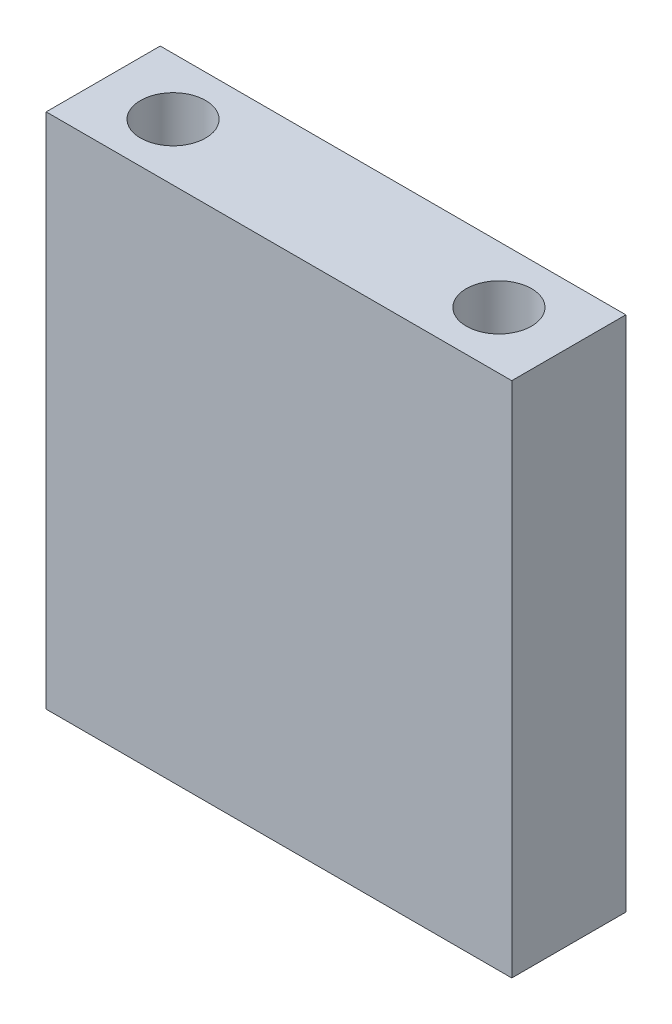
ISO-10303-21;
HEADER;
FILE_DESCRIPTION(('STEP AP214'),'2;1');
FILE_NAME('part.step','',(''),(''),'','','');
FILE_SCHEMA(('AUTOMOTIVE_DESIGN { 1 0 10303 214 1 1 1 1 }'));
ENDSEC;
DATA;
#1=APPLICATION_CONTEXT('core data for automotive mechanical design processes');
#2=APPLICATION_PROTOCOL_DEFINITION('international standard','automotive_design',2000,#1);
#3=PRODUCT_CONTEXT('',#1,'mechanical');
#4=PRODUCT('Part','Part','',(#3));
#5=PRODUCT_RELATED_PRODUCT_CATEGORY('part','',(#4));
#6=PRODUCT_DEFINITION_FORMATION('','',#4);
#7=PRODUCT_DEFINITION_CONTEXT('part definition',#1,'design');
#8=PRODUCT_DEFINITION('design','',#6,#7);
#9=PRODUCT_DEFINITION_SHAPE('','',#8);
#10=(LENGTH_UNIT() NAMED_UNIT(*) SI_UNIT(.MILLI.,.METRE.));
#11=(NAMED_UNIT(*) PLANE_ANGLE_UNIT() SI_UNIT($,.RADIAN.));
#12=(NAMED_UNIT(*) SI_UNIT($,.STERADIAN.) SOLID_ANGLE_UNIT());
#13=UNCERTAINTY_MEASURE_WITH_UNIT(LENGTH_MEASURE(1.E-05),#10,'distance_accuracy_value','');
#14=(GEOMETRIC_REPRESENTATION_CONTEXT(3) GLOBAL_UNCERTAINTY_ASSIGNED_CONTEXT((#13)) GLOBAL_UNIT_ASSIGNED_CONTEXT((#10,
#11,#12)) REPRESENTATION_CONTEXT('',''));
#15=CARTESIAN_POINT('',(0.,0.,0.));
#16=DIRECTION('',(0.,0.,1.));
#17=DIRECTION('',(1.,0.,0.));
#18=AXIS2_PLACEMENT_3D('',#15,#16,#17);
#19=CARTESIAN_POINT('',(14.2875,-15.875,3.5));
#20=DIRECTION('',(-1.,0.,0.));
#21=DIRECTION('',(0.,0.,1.));
#22=AXIS2_PLACEMENT_3D('',#19,#20,#21);
#23=PLANE('',#22);
#24=DIRECTION('',(0.,1.,0.));
#25=VECTOR('',#24,1.);
#26=CARTESIAN_POINT('',(14.2875,-15.875,-3.5));
#27=LINE('',#26,#25);
#28=CARTESIAN_POINT('',(14.2875,-15.875,-3.5));
#29=VERTEX_POINT('',#28);
#30=CARTESIAN_POINT('',(14.2875,15.875,-3.5));
#31=VERTEX_POINT('',#30);
#32=EDGE_CURVE('E102',#29,#31,#27,.T.);
#33=ORIENTED_EDGE('',*,*,#32,.T.);
#34=DIRECTION('',(0.,0.,-1.));
#35=VECTOR('',#34,1.);
#36=CARTESIAN_POINT('',(14.2875,15.875,3.5));
#37=LINE('',#36,#35);
#38=CARTESIAN_POINT('',(14.2875,15.875,3.5));
#39=VERTEX_POINT('',#38);
#40=EDGE_CURVE('E11',#39,#31,#37,.T.);
#41=ORIENTED_EDGE('',*,*,#40,.F.);
#42=DIRECTION('',(0.,1.,0.));
#43=VECTOR('',#42,1.);
#44=CARTESIAN_POINT('',(14.2875,-15.875,3.5));
#45=LINE('',#44,#43);
#46=CARTESIAN_POINT('',(14.2875,-15.875,3.5));
#47=VERTEX_POINT('',#46);
#48=EDGE_CURVE('E90',#47,#39,#45,.T.);
#49=ORIENTED_EDGE('',*,*,#48,.F.);
#50=DIRECTION('',(0.,0.,-1.));
#51=VECTOR('',#50,1.);
#52=CARTESIAN_POINT('',(14.2875,-15.875,3.5));
#53=LINE('',#52,#51);
#54=EDGE_CURVE('E98',#47,#29,#53,.T.);
#55=ORIENTED_EDGE('',*,*,#54,.T.);
#56=EDGE_LOOP('',(#33,#41,#49,#55));
#57=FACE_BOUND('',#56,.T.);
#58=ADVANCED_FACE('F39',(#57),#23,.F.);
#59=CARTESIAN_POINT('',(-14.2875,15.875,3.5));
#60=DIRECTION('',(0.,-1.,0.));
#61=DIRECTION('',(0.,0.,-1.));
#62=AXIS2_PLACEMENT_3D('',#59,#60,#61);
#63=PLANE('',#62);
#64=CARTESIAN_POINT('',(-10.,15.875,0.));
#65=DIRECTION('',(0.,1.,0.));
#66=DIRECTION('',(0.,0.,1.));
#67=AXIS2_PLACEMENT_3D('',#64,#65,#66);
#68=CIRCLE('',#67,2.);
#69=CARTESIAN_POINT('',(-10.,15.875,2.));
#70=VERTEX_POINT('',#69);
#71=EDGE_CURVE('E122',#70,#70,#68,.T.);
#72=ORIENTED_EDGE('',*,*,#71,.F.);
#73=EDGE_LOOP('',(#72));
#74=FACE_BOUND('',#73,.T.);
#75=CARTESIAN_POINT('',(9.99999999999999,15.875,0.));
#76=DIRECTION('',(0.,1.,0.));
#77=DIRECTION('',(0.,0.,-1.));
#78=AXIS2_PLACEMENT_3D('',#75,#76,#77);
#79=CIRCLE('',#78,2.);
#80=CARTESIAN_POINT('',(9.99999999999999,15.875,-2.));
#81=VERTEX_POINT('',#80);
#82=EDGE_CURVE('E119',#81,#81,#79,.T.);
#83=ORIENTED_EDGE('',*,*,#82,.F.);
#84=EDGE_LOOP('',(#83));
#85=FACE_BOUND('',#84,.T.);
#86=DIRECTION('',(-1.,0.,0.));
#87=VECTOR('',#86,1.);
#88=CARTESIAN_POINT('',(-14.2875,15.875,-3.5));
#89=LINE('',#88,#87);
#90=CARTESIAN_POINT('',(-14.2875,15.875,-3.5));
#91=VERTEX_POINT('',#90);
#92=EDGE_CURVE('E94',#31,#91,#89,.T.);
#93=ORIENTED_EDGE('',*,*,#92,.T.);
#94=DIRECTION('',(0.,0.,-1.));
#95=VECTOR('',#94,1.);
#96=CARTESIAN_POINT('',(-14.2875,15.875,3.5));
#97=LINE('',#96,#95);
#98=CARTESIAN_POINT('',(-14.2875,15.875,3.5));
#99=VERTEX_POINT('',#98);
#100=EDGE_CURVE('E47',#99,#91,#97,.T.);
#101=ORIENTED_EDGE('',*,*,#100,.F.);
#102=DIRECTION('',(-1.,0.,0.));
#103=VECTOR('',#102,1.);
#104=CARTESIAN_POINT('',(-14.2875,15.875,3.5));
#105=LINE('',#104,#103);
#106=EDGE_CURVE('E85',#39,#99,#105,.T.);
#107=ORIENTED_EDGE('',*,*,#106,.F.);
#108=ORIENTED_EDGE('',*,*,#40,.T.);
#109=EDGE_LOOP('',(#93,#101,#107,#108));
#110=FACE_BOUND('',#109,.T.);
#111=ADVANCED_FACE('F93',(#74,#85,#110),#63,.F.);
#112=CARTESIAN_POINT('',(-14.2875,-15.875,3.5));
#113=DIRECTION('',(1.,0.,0.));
#114=DIRECTION('',(0.,0.,-1.));
#115=AXIS2_PLACEMENT_3D('',#112,#113,#114);
#116=PLANE('',#115);
#117=DIRECTION('',(0.,-1.,0.));
#118=VECTOR('',#117,1.);
#119=CARTESIAN_POINT('',(-14.2875,-15.875,-3.5));
#120=LINE('',#119,#118);
#121=CARTESIAN_POINT('',(-14.2875,-15.875,-3.5));
#122=VERTEX_POINT('',#121);
#123=EDGE_CURVE('E72',#91,#122,#120,.T.);
#124=ORIENTED_EDGE('',*,*,#123,.T.);
#125=DIRECTION('',(0.,0.,-1.));
#126=VECTOR('',#125,1.);
#127=CARTESIAN_POINT('',(-14.2875,-15.875,3.5));
#128=LINE('',#127,#126);
#129=CARTESIAN_POINT('',(-14.2875,-15.875,3.5));
#130=VERTEX_POINT('',#129);
#131=EDGE_CURVE('E95',#130,#122,#128,.T.);
#132=ORIENTED_EDGE('',*,*,#131,.F.);
#133=DIRECTION('',(0.,-1.,0.));
#134=VECTOR('',#133,1.);
#135=CARTESIAN_POINT('',(-14.2875,-15.875,3.5));
#136=LINE('',#135,#134);
#137=EDGE_CURVE('E88',#99,#130,#136,.T.);
#138=ORIENTED_EDGE('',*,*,#137,.F.);
#139=ORIENTED_EDGE('',*,*,#100,.T.);
#140=EDGE_LOOP('',(#124,#132,#138,#139));
#141=FACE_BOUND('',#140,.T.);
#142=ADVANCED_FACE('F96',(#141),#116,.F.);
#143=CARTESIAN_POINT('',(-14.2875,-15.875,3.5));
#144=DIRECTION('',(0.,1.,0.));
#145=DIRECTION('',(0.,0.,1.));
#146=AXIS2_PLACEMENT_3D('',#143,#144,#145);
#147=PLANE('',#146);
#148=DIRECTION('',(1.,0.,0.));
#149=VECTOR('',#148,1.);
#150=CARTESIAN_POINT('',(-14.2875,-15.875,-3.5));
#151=LINE('',#150,#149);
#152=EDGE_CURVE('E78',#122,#29,#151,.T.);
#153=ORIENTED_EDGE('',*,*,#152,.T.);
#154=ORIENTED_EDGE('',*,*,#54,.F.);
#155=DIRECTION('',(1.,0.,0.));
#156=VECTOR('',#155,1.);
#157=CARTESIAN_POINT('',(-14.2875,-15.875,3.5));
#158=LINE('',#157,#156);
#159=EDGE_CURVE('E55',#130,#47,#158,.T.);
#160=ORIENTED_EDGE('',*,*,#159,.F.);
#161=ORIENTED_EDGE('',*,*,#131,.T.);
#162=EDGE_LOOP('',(#153,#154,#160,#161));
#163=FACE_BOUND('',#162,.T.);
#164=ADVANCED_FACE('F110',(#163),#147,.F.);
#165=CARTESIAN_POINT('',(0.,0.,3.5));
#166=DIRECTION('',(0.,0.,-1.));
#167=DIRECTION('',(-1.,0.,0.));
#168=AXIS2_PLACEMENT_3D('',#165,#166,#167);
#169=PLANE('',#168);
#170=ORIENTED_EDGE('',*,*,#48,.T.);
#171=ORIENTED_EDGE('',*,*,#106,.T.);
#172=ORIENTED_EDGE('',*,*,#137,.T.);
#173=ORIENTED_EDGE('',*,*,#159,.T.);
#174=EDGE_LOOP('',(#170,#171,#172,#173));
#175=FACE_BOUND('',#174,.T.);
#176=ADVANCED_FACE('F86',(#175),#169,.F.);
#177=CARTESIAN_POINT('',(0.,0.,-3.5));
#178=DIRECTION('',(0.,0.,-1.));
#179=DIRECTION('',(-1.,0.,0.));
#180=AXIS2_PLACEMENT_3D('',#177,#178,#179);
#181=PLANE('',#180);
#182=ORIENTED_EDGE('',*,*,#32,.F.);
#183=ORIENTED_EDGE('',*,*,#152,.F.);
#184=ORIENTED_EDGE('',*,*,#123,.F.);
#185=ORIENTED_EDGE('',*,*,#92,.F.);
#186=EDGE_LOOP('',(#182,#183,#184,#185));
#187=FACE_BOUND('',#186,.T.);
#188=ADVANCED_FACE('F113',(#187),#181,.T.);
#189=CARTESIAN_POINT('',(9.99999999999999,9.875,0.));
#190=DIRECTION('',(0.,1.,0.));
#191=DIRECTION('',(0.,0.,1.));
#192=AXIS2_PLACEMENT_3D('',#189,#190,#191);
#193=CYLINDRICAL_SURFACE('',#192,2.);
#194=CARTESIAN_POINT('',(9.99999999999999,9.875,0.));
#195=DIRECTION('',(0.,1.,0.));
#196=DIRECTION('',(0.,0.,-1.));
#197=AXIS2_PLACEMENT_3D('',#194,#195,#196);
#198=CIRCLE('',#197,2.);
#199=CARTESIAN_POINT('',(9.99999999999999,9.875,-2.));
#200=VERTEX_POINT('',#199);
#201=EDGE_CURVE('E116',#200,#200,#198,.T.);
#202=ORIENTED_EDGE('',*,*,#201,.F.);
#203=EDGE_LOOP('',(#202));
#204=FACE_BOUND('',#203,.T.);
#205=ORIENTED_EDGE('',*,*,#82,.T.);
#206=EDGE_LOOP('',(#205));
#207=FACE_BOUND('',#206,.T.);
#208=ADVANCED_FACE('F141',(#204,#207),#193,.F.);
#209=CARTESIAN_POINT('',(9.99999999999999,9.875,0.));
#210=DIRECTION('',(0.,-1.,0.));
#211=DIRECTION('',(0.,0.,-1.));
#212=AXIS2_PLACEMENT_3D('',#209,#210,#211);
#213=PLANE('',#212);
#214=ORIENTED_EDGE('',*,*,#201,.T.);
#215=EDGE_LOOP('',(#214));
#216=FACE_BOUND('',#215,.T.);
#217=ADVANCED_FACE('F133',(#216),#213,.F.);
#218=CARTESIAN_POINT('',(-10.,9.875,0.));
#219=DIRECTION('',(0.,1.,0.));
#220=DIRECTION('',(0.,0.,1.));
#221=AXIS2_PLACEMENT_3D('',#218,#219,#220);
#222=CYLINDRICAL_SURFACE('',#221,2.);
#223=CARTESIAN_POINT('',(-10.,9.875,0.));
#224=DIRECTION('',(0.,1.,0.));
#225=DIRECTION('',(0.,0.,1.));
#226=AXIS2_PLACEMENT_3D('',#223,#224,#225);
#227=CIRCLE('',#226,2.);
#228=CARTESIAN_POINT('',(-10.,9.875,2.));
#229=VERTEX_POINT('',#228);
#230=EDGE_CURVE('E105',#229,#229,#227,.T.);
#231=ORIENTED_EDGE('',*,*,#230,.F.);
#232=EDGE_LOOP('',(#231));
#233=FACE_BOUND('',#232,.T.);
#234=ORIENTED_EDGE('',*,*,#71,.T.);
#235=EDGE_LOOP('',(#234));
#236=FACE_BOUND('',#235,.T.);
#237=ADVANCED_FACE('F130',(#233,#236),#222,.F.);
#238=CARTESIAN_POINT('',(-10.,9.875,0.));
#239=DIRECTION('',(0.,1.,0.));
#240=DIRECTION('',(0.,0.,1.));
#241=AXIS2_PLACEMENT_3D('',#238,#239,#240);
#242=PLANE('',#241);
#243=ORIENTED_EDGE('',*,*,#230,.T.);
#244=EDGE_LOOP('',(#243));
#245=FACE_BOUND('',#244,.T.);
#246=ADVANCED_FACE('F128',(#245),#242,.T.);
#247=CLOSED_SHELL('',(#58,#111,#142,#164,#176,#188,#208,#217,#237,#246));
#248=MANIFOLD_SOLID_BREP('B2',#247);
#249=ADVANCED_BREP_SHAPE_REPRESENTATION('',(#18,#248),#14);
#250=SHAPE_DEFINITION_REPRESENTATION(#9,#249);
ENDSEC;
END-ISO-10303-21;
